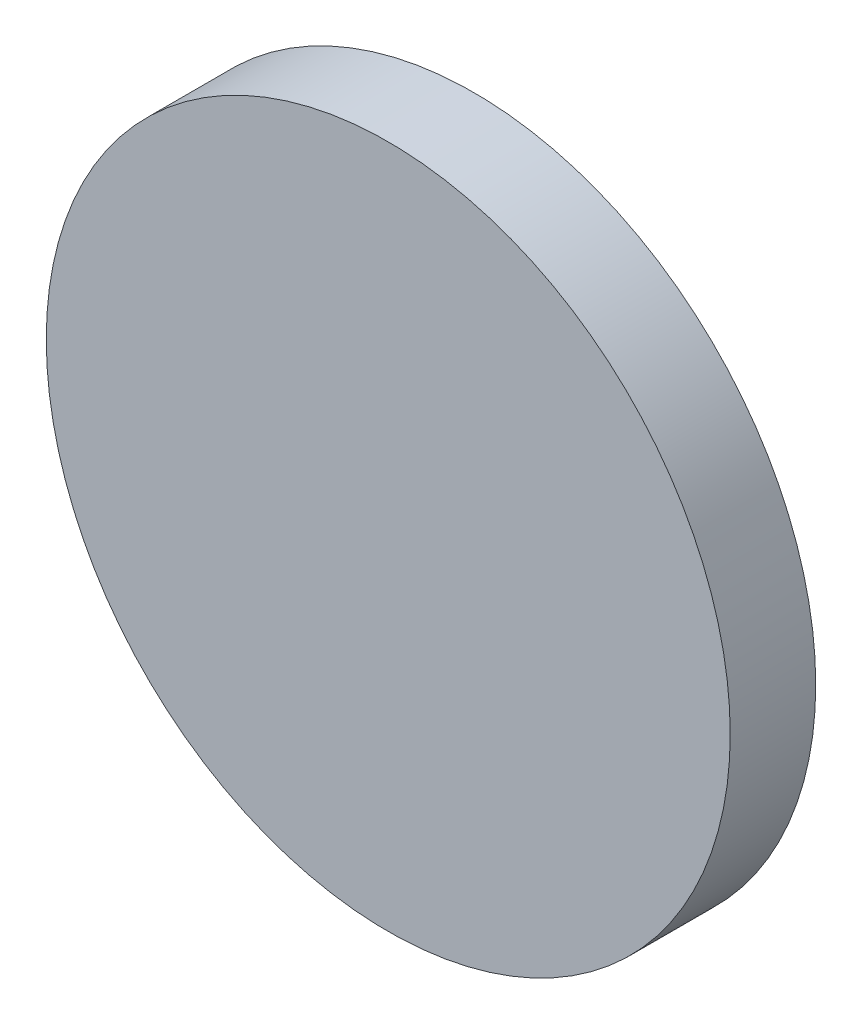
ISO-10303-21;
HEADER;
FILE_DESCRIPTION(('STEP AP214'),'2;1');
FILE_NAME('part.step','',(''),(''),'','','');
FILE_SCHEMA(('AUTOMOTIVE_DESIGN { 1 0 10303 214 1 1 1 1 }'));
ENDSEC;
DATA;
#1=APPLICATION_CONTEXT('core data for automotive mechanical design processes');
#2=APPLICATION_PROTOCOL_DEFINITION('international standard','automotive_design',2000,#1);
#3=PRODUCT_CONTEXT('',#1,'mechanical');
#4=PRODUCT('Part','Part','',(#3));
#5=PRODUCT_RELATED_PRODUCT_CATEGORY('part','',(#4));
#6=PRODUCT_DEFINITION_FORMATION('','',#4);
#7=PRODUCT_DEFINITION_CONTEXT('part definition',#1,'design');
#8=PRODUCT_DEFINITION('design','',#6,#7);
#9=PRODUCT_DEFINITION_SHAPE('','',#8);
#10=(LENGTH_UNIT() NAMED_UNIT(*) SI_UNIT(.MILLI.,.METRE.));
#11=(NAMED_UNIT(*) PLANE_ANGLE_UNIT() SI_UNIT($,.RADIAN.));
#12=(NAMED_UNIT(*) SI_UNIT($,.STERADIAN.) SOLID_ANGLE_UNIT());
#13=UNCERTAINTY_MEASURE_WITH_UNIT(LENGTH_MEASURE(1.E-05),#10,'distance_accuracy_value','');
#14=(GEOMETRIC_REPRESENTATION_CONTEXT(3) GLOBAL_UNCERTAINTY_ASSIGNED_CONTEXT((#13)) GLOBAL_UNIT_ASSIGNED_CONTEXT((#10,
#11,#12)) REPRESENTATION_CONTEXT('',''));
#15=CARTESIAN_POINT('',(0.,0.,0.));
#16=DIRECTION('',(0.,0.,1.));
#17=DIRECTION('',(1.,0.,0.));
#18=AXIS2_PLACEMENT_3D('',#15,#16,#17);
#19=CARTESIAN_POINT('',(0.,0.,3.175));
#20=DIRECTION('',(0.,0.,-1.));
#21=DIRECTION('',(-1.,0.,0.));
#22=AXIS2_PLACEMENT_3D('',#19,#20,#21);
#23=CYLINDRICAL_SURFACE('',#22,12.7);
#24=CARTESIAN_POINT('',(0.,0.,3.175));
#25=DIRECTION('',(0.,0.,1.));
#26=DIRECTION('',(1.,0.,0.));
#27=AXIS2_PLACEMENT_3D('',#24,#25,#26);
#28=CIRCLE('',#27,12.7);
#29=CARTESIAN_POINT('',(12.7,0.,3.175));
#30=VERTEX_POINT('',#29);
#31=EDGE_CURVE('E10',#30,#30,#28,.T.);
#32=ORIENTED_EDGE('',*,*,#31,.F.);
#33=EDGE_LOOP('',(#32));
#34=FACE_BOUND('',#33,.T.);
#35=CARTESIAN_POINT('',(0.,0.,0.));
#36=DIRECTION('',(0.,0.,1.));
#37=DIRECTION('',(1.,0.,0.));
#38=AXIS2_PLACEMENT_3D('',#35,#36,#37);
#39=CIRCLE('',#38,12.7);
#40=CARTESIAN_POINT('',(12.7,0.,0.));
#41=VERTEX_POINT('',#40);
#42=EDGE_CURVE('E40',#41,#41,#39,.T.);
#43=ORIENTED_EDGE('',*,*,#42,.T.);
#44=EDGE_LOOP('',(#43));
#45=FACE_BOUND('',#44,.T.);
#46=ADVANCED_FACE('F37',(#34,#45),#23,.T.);
#47=CARTESIAN_POINT('',(0.,0.,3.175));
#48=DIRECTION('',(0.,0.,1.));
#49=DIRECTION('',(1.,0.,0.));
#50=AXIS2_PLACEMENT_3D('',#47,#48,#49);
#51=PLANE('',#50);
#52=ORIENTED_EDGE('',*,*,#31,.T.);
#53=EDGE_LOOP('',(#52));
#54=FACE_BOUND('',#53,.T.);
#55=ADVANCED_FACE('F54',(#54),#51,.T.);
#56=CARTESIAN_POINT('',(0.,0.,0.));
#57=DIRECTION('',(0.,0.,1.));
#58=DIRECTION('',(1.,0.,0.));
#59=AXIS2_PLACEMENT_3D('',#56,#57,#58);
#60=PLANE('',#59);
#61=ORIENTED_EDGE('',*,*,#42,.F.);
#62=EDGE_LOOP('',(#61));
#63=FACE_BOUND('',#62,.T.);
#64=ADVANCED_FACE('F52',(#63),#60,.F.);
#65=CLOSED_SHELL('',(#46,#55,#64));
#66=MANIFOLD_SOLID_BREP('B2',#65);
#67=ADVANCED_BREP_SHAPE_REPRESENTATION('',(#18,#66),#14);
#68=SHAPE_DEFINITION_REPRESENTATION(#9,#67);
ENDSEC;
END-ISO-10303-21;
